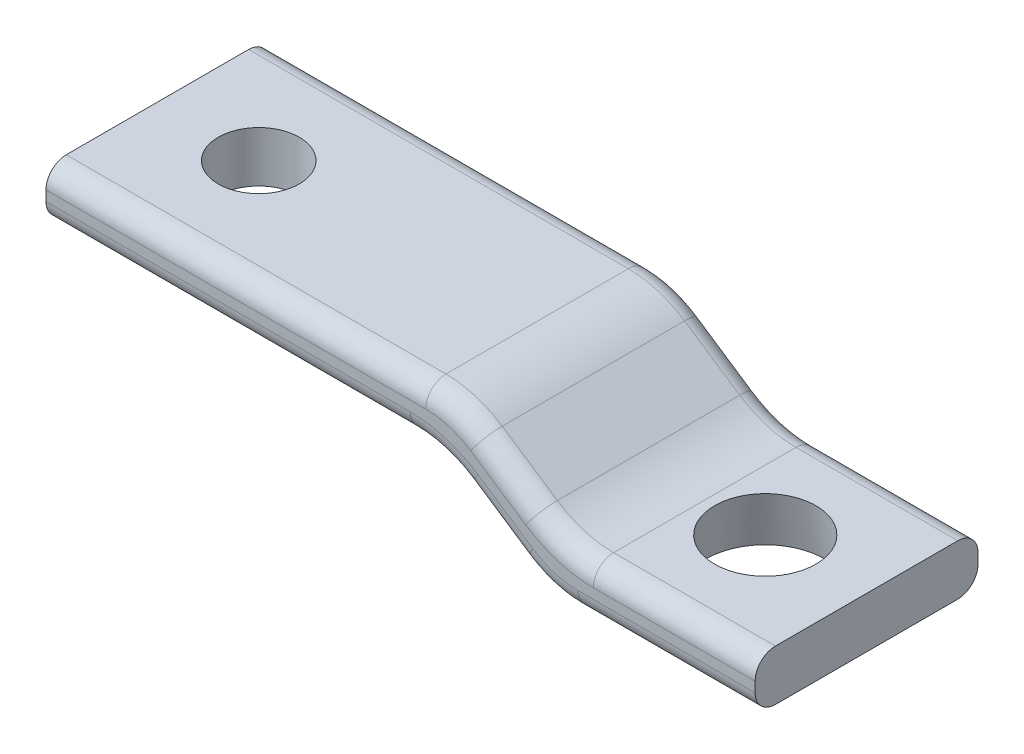
ISO-10303-21;
HEADER;
FILE_DESCRIPTION(('STEP AP214'),'2;1');
FILE_NAME('part.step','',(''),(''),'','','');
FILE_SCHEMA(('AUTOMOTIVE_DESIGN { 1 0 10303 214 1 1 1 1 }'));
ENDSEC;
DATA;
#1=APPLICATION_CONTEXT('core data for automotive mechanical design processes');
#2=APPLICATION_PROTOCOL_DEFINITION('international standard','automotive_design',2000,#1);
#3=PRODUCT_CONTEXT('',#1,'mechanical');
#4=PRODUCT('Part','Part','',(#3));
#5=PRODUCT_RELATED_PRODUCT_CATEGORY('part','',(#4));
#6=PRODUCT_DEFINITION_FORMATION('','',#4);
#7=PRODUCT_DEFINITION_CONTEXT('part definition',#1,'design');
#8=PRODUCT_DEFINITION('design','',#6,#7);
#9=PRODUCT_DEFINITION_SHAPE('','',#8);
#10=(LENGTH_UNIT() NAMED_UNIT(*) SI_UNIT(.MILLI.,.METRE.));
#11=(NAMED_UNIT(*) PLANE_ANGLE_UNIT() SI_UNIT($,.RADIAN.));
#12=(NAMED_UNIT(*) SI_UNIT($,.STERADIAN.) SOLID_ANGLE_UNIT());
#13=UNCERTAINTY_MEASURE_WITH_UNIT(LENGTH_MEASURE(1.E-05),#10,'distance_accuracy_value','');
#14=(GEOMETRIC_REPRESENTATION_CONTEXT(3) GLOBAL_UNCERTAINTY_ASSIGNED_CONTEXT((#13)) GLOBAL_UNIT_ASSIGNED_CONTEXT((#10,
#11,#12)) REPRESENTATION_CONTEXT('',''));
#15=CARTESIAN_POINT('',(0.,0.,0.));
#16=DIRECTION('',(0.,0.,1.));
#17=DIRECTION('',(1.,0.,0.));
#18=AXIS2_PLACEMENT_3D('',#15,#16,#17);
#19=CARTESIAN_POINT('',(52.5157724893177,-12.,11.));
#20=DIRECTION('',(0.,1.,0.));
#21=DIRECTION('',(0.,0.,1.));
#22=AXIS2_PLACEMENT_3D('',#19,#20,#21);
#23=PLANE('',#22);
#24=DIRECTION('',(0.,0.,-1.));
#25=VECTOR('',#24,1.);
#26=CARTESIAN_POINT('',(70.,-12.,11.));
#27=LINE('',#26,#25);
#28=CARTESIAN_POINT('',(70.,-12.,9.));
#29=VERTEX_POINT('',#28);
#30=CARTESIAN_POINT('',(70.,-12.,-9.));
#31=VERTEX_POINT('',#30);
#32=EDGE_CURVE('E321',#29,#31,#27,.T.);
#33=ORIENTED_EDGE('',*,*,#32,.F.);
#34=DIRECTION('',(1.,0.,0.));
#35=VECTOR('',#34,1.);
#36=CARTESIAN_POINT('',(52.5157724893177,-12.,9.));
#37=LINE('',#36,#35);
#38=CARTESIAN_POINT('',(52.5157724893177,-12.,9.));
#39=VERTEX_POINT('',#38);
#40=EDGE_CURVE('E275',#29,#39,#37,.F.);
#41=ORIENTED_EDGE('',*,*,#40,.T.);
#42=DIRECTION('',(0.,0.,-1.));
#43=VECTOR('',#42,1.);
#44=CARTESIAN_POINT('',(52.5157724893177,-12.,11.));
#45=LINE('',#44,#43);
#46=CARTESIAN_POINT('',(52.5157724893177,-12.,-9.));
#47=VERTEX_POINT('',#46);
#48=EDGE_CURVE('E318',#39,#47,#45,.T.);
#49=ORIENTED_EDGE('',*,*,#48,.T.);
#50=DIRECTION('',(1.,0.,0.));
#51=VECTOR('',#50,1.);
#52=CARTESIAN_POINT('',(52.5157724893177,-12.,-9.));
#53=LINE('',#52,#51);
#54=EDGE_CURVE('E277',#47,#31,#53,.T.);
#55=ORIENTED_EDGE('',*,*,#54,.T.);
#56=EDGE_LOOP('',(#33,#41,#49,#55));
#57=FACE_BOUND('',#56,.T.);
#58=CARTESIAN_POINT('',(60.,-12.,0.));
#59=DIRECTION('',(0.,1.,0.));
#60=DIRECTION('',(0.,0.,1.));
#61=AXIS2_PLACEMENT_3D('',#58,#59,#60);
#62=CIRCLE('',#61,5.88163490354233);
#63=CARTESIAN_POINT('',(60.,-12.,5.88163490354233));
#64=VERTEX_POINT('',#63);
#65=EDGE_CURVE('E398',#64,#64,#62,.T.);
#66=ORIENTED_EDGE('',*,*,#65,.T.);
#67=EDGE_LOOP('',(#66));
#68=FACE_BOUND('',#67,.T.);
#69=ADVANCED_FACE('F35',(#57,#68),#23,.F.);
#70=CARTESIAN_POINT('',(54.0315449786353,-7.,11.));
#71=DIRECTION('',(0.,-1.,0.));
#72=DIRECTION('',(0.,0.,-1.));
#73=AXIS2_PLACEMENT_3D('',#70,#71,#72);
#74=PLANE('',#73);
#75=DIRECTION('',(0.,0.,-1.));
#76=VECTOR('',#75,1.);
#77=CARTESIAN_POINT('',(54.0315449786353,-7.,11.));
#78=LINE('',#77,#76);
#79=CARTESIAN_POINT('',(54.0315449786353,-7.,9.));
#80=VERTEX_POINT('',#79);
#81=CARTESIAN_POINT('',(54.0315449786353,-7.,-9.));
#82=VERTEX_POINT('',#81);
#83=EDGE_CURVE('E327',#80,#82,#78,.T.);
#84=ORIENTED_EDGE('',*,*,#83,.F.);
#85=DIRECTION('',(-1.,0.,0.));
#86=VECTOR('',#85,1.);
#87=CARTESIAN_POINT('',(70.,-7.,9.));
#88=LINE('',#87,#86);
#89=CARTESIAN_POINT('',(70.,-7.,9.));
#90=VERTEX_POINT('',#89);
#91=EDGE_CURVE('E258',#80,#90,#88,.F.);
#92=ORIENTED_EDGE('',*,*,#91,.T.);
#93=DIRECTION('',(0.,0.,-1.));
#94=VECTOR('',#93,1.);
#95=CARTESIAN_POINT('',(70.,-7.,11.));
#96=LINE('',#95,#94);
#97=CARTESIAN_POINT('',(70.,-7.,-9.));
#98=VERTEX_POINT('',#97);
#99=EDGE_CURVE('E324',#90,#98,#96,.T.);
#100=ORIENTED_EDGE('',*,*,#99,.T.);
#101=DIRECTION('',(-1.,0.,0.));
#102=VECTOR('',#101,1.);
#103=CARTESIAN_POINT('',(54.0315449786353,-7.,-9.));
#104=LINE('',#103,#102);
#105=EDGE_CURVE('E260',#98,#82,#104,.T.);
#106=ORIENTED_EDGE('',*,*,#105,.T.);
#107=EDGE_LOOP('',(#84,#92,#100,#106));
#108=FACE_BOUND('',#107,.T.);
#109=CARTESIAN_POINT('',(60.,-7.,0.));
#110=DIRECTION('',(0.,1.,0.));
#111=DIRECTION('',(0.,0.,1.));
#112=AXIS2_PLACEMENT_3D('',#109,#110,#111);
#113=CIRCLE('',#112,5.);
#114=CARTESIAN_POINT('',(60.,-7.,5.));
#115=VERTEX_POINT('',#114);
#116=EDGE_CURVE('E401',#115,#115,#113,.T.);
#117=ORIENTED_EDGE('',*,*,#116,.F.);
#118=EDGE_LOOP('',(#117));
#119=FACE_BOUND('',#118,.T.);
#120=ADVANCED_FACE('F408',(#108,#119),#74,.F.);
#121=CARTESIAN_POINT('',(0.,0.,11.));
#122=DIRECTION('',(1.,0.,0.));
#123=DIRECTION('',(0.,0.,-1.));
#124=AXIS2_PLACEMENT_3D('',#121,#122,#123);
#125=PLANE('',#124);
#126=DIRECTION('',(0.,0.,-1.));
#127=VECTOR('',#126,1.);
#128=CARTESIAN_POINT('',(0.,-5.,11.));
#129=LINE('',#128,#127);
#130=CARTESIAN_POINT('',(0.,-5.,9.));
#131=VERTEX_POINT('',#130);
#132=CARTESIAN_POINT('',(0.,-5.,-9.));
#133=VERTEX_POINT('',#132);
#134=EDGE_CURVE('E205',#131,#133,#129,.T.);
#135=ORIENTED_EDGE('',*,*,#134,.F.);
#136=CARTESIAN_POINT('',(0.,-3.,9.));
#137=DIRECTION('',(1.,0.,0.));
#138=DIRECTION('',(0.,0.,-1.));
#139=AXIS2_PLACEMENT_3D('',#136,#137,#138);
#140=CIRCLE('',#139,2.);
#141=CARTESIAN_POINT('',(0.,-3.,11.));
#142=VERTEX_POINT('',#141);
#143=EDGE_CURVE('E209',#131,#142,#140,.F.);
#144=ORIENTED_EDGE('',*,*,#143,.T.);
#145=DIRECTION('',(0.,-1.,0.));
#146=VECTOR('',#145,1.);
#147=CARTESIAN_POINT('',(0.,0.,11.));
#148=LINE('',#147,#146);
#149=CARTESIAN_POINT('',(0.,-2.,11.));
#150=VERTEX_POINT('',#149);
#151=EDGE_CURVE('E198',#150,#142,#148,.T.);
#152=ORIENTED_EDGE('',*,*,#151,.F.);
#153=CARTESIAN_POINT('',(0.,-2.,9.));
#154=DIRECTION('',(1.,0.,0.));
#155=DIRECTION('',(0.,0.,-1.));
#156=AXIS2_PLACEMENT_3D('',#153,#154,#155);
#157=CIRCLE('',#156,2.);
#158=CARTESIAN_POINT('',(0.,0.,9.));
#159=VERTEX_POINT('',#158);
#160=EDGE_CURVE('E56',#150,#159,#157,.F.);
#161=ORIENTED_EDGE('',*,*,#160,.T.);
#162=DIRECTION('',(0.,0.,-1.));
#163=VECTOR('',#162,1.);
#164=CARTESIAN_POINT('',(0.,0.,11.));
#165=LINE('',#164,#163);
#166=CARTESIAN_POINT('',(0.,0.,-9.));
#167=VERTEX_POINT('',#166);
#168=EDGE_CURVE('E338',#159,#167,#165,.T.);
#169=ORIENTED_EDGE('',*,*,#168,.T.);
#170=CARTESIAN_POINT('',(0.,-2.,-9.));
#171=DIRECTION('',(1.,0.,0.));
#172=DIRECTION('',(0.,0.,-1.));
#173=AXIS2_PLACEMENT_3D('',#170,#171,#172);
#174=CIRCLE('',#173,2.);
#175=CARTESIAN_POINT('',(0.,-2.,-11.));
#176=VERTEX_POINT('',#175);
#177=EDGE_CURVE('E218',#167,#176,#174,.F.);
#178=ORIENTED_EDGE('',*,*,#177,.T.);
#179=DIRECTION('',(0.,-1.,0.));
#180=VECTOR('',#179,1.);
#181=CARTESIAN_POINT('',(0.,0.,-11.));
#182=LINE('',#181,#180);
#183=CARTESIAN_POINT('',(0.,-3.,-11.));
#184=VERTEX_POINT('',#183);
#185=EDGE_CURVE('E344',#176,#184,#182,.T.);
#186=ORIENTED_EDGE('',*,*,#185,.T.);
#187=CARTESIAN_POINT('',(0.,-3.,-9.));
#188=DIRECTION('',(1.,0.,0.));
#189=DIRECTION('',(0.,0.,-1.));
#190=AXIS2_PLACEMENT_3D('',#187,#188,#189);
#191=CIRCLE('',#190,2.);
#192=EDGE_CURVE('E215',#184,#133,#191,.F.);
#193=ORIENTED_EDGE('',*,*,#192,.T.);
#194=EDGE_LOOP('',(#135,#144,#152,#161,#169,#178,#186,#193));
#195=FACE_BOUND('',#194,.T.);
#196=ADVANCED_FACE('F37',(#195),#125,.F.);
#197=CARTESIAN_POINT('',(0.,-5.,11.));
#198=DIRECTION('',(0.,1.,0.));
#199=DIRECTION('',(-1.,0.,0.));
#200=AXIS2_PLACEMENT_3D('',#197,#198,#199);
#201=PLANE('',#200);
#202=CARTESIAN_POINT('',(10.,-5.,0.));
#203=DIRECTION('',(0.,1.,0.));
#204=DIRECTION('',(-1.,0.,0.));
#205=AXIS2_PLACEMENT_3D('',#202,#203,#204);
#206=CIRCLE('',#205,4.);
#207=CARTESIAN_POINT('',(6.,-5.,0.));
#208=VERTEX_POINT('',#207);
#209=EDGE_CURVE('E392',#208,#208,#206,.T.);
#210=ORIENTED_EDGE('',*,*,#209,.T.);
#211=EDGE_LOOP('',(#210));
#212=FACE_BOUND('',#211,.T.);
#213=DIRECTION('',(0.,0.,-1.));
#214=VECTOR('',#213,1.);
#215=CARTESIAN_POINT('',(35.9684550213647,-5.,11.));
#216=LINE('',#215,#214);
#217=CARTESIAN_POINT('',(35.9684550213647,-5.,9.));
#218=VERTEX_POINT('',#217);
#219=CARTESIAN_POINT('',(35.9684550213647,-5.,-9.));
#220=VERTEX_POINT('',#219);
#221=EDGE_CURVE('E309',#218,#220,#216,.T.);
#222=ORIENTED_EDGE('',*,*,#221,.F.);
#223=DIRECTION('',(1.,0.,0.));
#224=VECTOR('',#223,1.);
#225=CARTESIAN_POINT('',(0.,-5.,9.));
#226=LINE('',#225,#224);
#227=EDGE_CURVE('E222',#218,#131,#226,.F.);
#228=ORIENTED_EDGE('',*,*,#227,.T.);
#229=ORIENTED_EDGE('',*,*,#134,.T.);
#230=DIRECTION('',(1.,0.,0.));
#231=VECTOR('',#230,1.);
#232=CARTESIAN_POINT('',(0.,-5.,-9.));
#233=LINE('',#232,#231);
#234=EDGE_CURVE('E224',#133,#220,#233,.T.);
#235=ORIENTED_EDGE('',*,*,#234,.T.);
#236=EDGE_LOOP('',(#222,#228,#229,#235));
#237=FACE_BOUND('',#236,.T.);
#238=ADVANCED_FACE('F416',(#212,#237),#201,.F.);
#239=CARTESIAN_POINT('',(35.9684550213647,-15.,11.));
#240=DIRECTION('',(0.,0.,-1.));
#241=DIRECTION('',(-1.,0.,0.));
#242=AXIS2_PLACEMENT_3D('',#239,#240,#241);
#243=CYLINDRICAL_SURFACE('',#242,10.);
#244=DIRECTION('',(0.,0.,-1.));
#245=VECTOR('',#244,1.);
#246=CARTESIAN_POINT('',(41.5212302249336,-6.68334877858698,11.));
#247=LINE('',#246,#245);
#248=CARTESIAN_POINT('',(41.5212302249336,-6.68334877858698,9.));
#249=VERTEX_POINT('',#248);
#250=CARTESIAN_POINT('',(41.5212302249336,-6.68334877858698,-9.));
#251=VERTEX_POINT('',#250);
#252=EDGE_CURVE('E312',#249,#251,#247,.T.);
#253=ORIENTED_EDGE('',*,*,#252,.F.);
#254=CARTESIAN_POINT('',(35.9684550213647,-15.,9.));
#255=DIRECTION('',(0.,0.,1.));
#256=DIRECTION('',(1.,0.,0.));
#257=AXIS2_PLACEMENT_3D('',#254,#255,#256);
#258=CIRCLE('',#257,10.);
#259=EDGE_CURVE('E263',#249,#218,#258,.T.);
#260=ORIENTED_EDGE('',*,*,#259,.T.);
#261=ORIENTED_EDGE('',*,*,#221,.T.);
#262=CARTESIAN_POINT('',(35.9684550213647,-15.,-9.));
#263=DIRECTION('',(0.,0.,1.));
#264=DIRECTION('',(1.,0.,0.));
#265=AXIS2_PLACEMENT_3D('',#262,#263,#264);
#266=CIRCLE('',#265,10.);
#267=EDGE_CURVE('E265',#220,#251,#266,.F.);
#268=ORIENTED_EDGE('',*,*,#267,.T.);
#269=EDGE_LOOP('',(#253,#260,#261,#268));
#270=FACE_BOUND('',#269,.T.);
#271=ADVANCED_FACE('F435',(#270),#243,.F.);
#272=CARTESIAN_POINT('',(41.5212302249336,-6.68334877858698,11.));
#273=DIRECTION('',(0.555277520356883,0.831665122141305,0.));
#274=DIRECTION('',(-0.831665122141305,0.555277520356883,0.));
#275=AXIS2_PLACEMENT_3D('',#272,#273,#274);
#276=PLANE('',#275);
#277=DIRECTION('',(0.,0.,-1.));
#278=VECTOR('',#277,1.);
#279=CARTESIAN_POINT('',(46.9629972857488,-10.316651221413,11.));
#280=LINE('',#279,#278);
#281=CARTESIAN_POINT('',(46.9629972857488,-10.316651221413,9.));
#282=VERTEX_POINT('',#281);
#283=CARTESIAN_POINT('',(46.9629972857488,-10.316651221413,-9.));
#284=VERTEX_POINT('',#283);
#285=EDGE_CURVE('E315',#282,#284,#280,.T.);
#286=ORIENTED_EDGE('',*,*,#285,.F.);
#287=DIRECTION('',(0.831665122141305,-0.555277520356883,0.));
#288=VECTOR('',#287,1.);
#289=CARTESIAN_POINT('',(41.5212302249336,-6.68334877858698,9.));
#290=LINE('',#289,#288);
#291=EDGE_CURVE('E267',#282,#249,#290,.F.);
#292=ORIENTED_EDGE('',*,*,#291,.T.);
#293=ORIENTED_EDGE('',*,*,#252,.T.);
#294=DIRECTION('',(0.831665122141305,-0.555277520356883,0.));
#295=VECTOR('',#294,1.);
#296=CARTESIAN_POINT('',(41.5212302249336,-6.68334877858698,-9.));
#297=LINE('',#296,#295);
#298=EDGE_CURVE('E269',#251,#284,#297,.T.);
#299=ORIENTED_EDGE('',*,*,#298,.T.);
#300=EDGE_LOOP('',(#286,#292,#293,#299));
#301=FACE_BOUND('',#300,.T.);
#302=ADVANCED_FACE('F431',(#301),#276,.F.);
#303=CARTESIAN_POINT('',(52.5157724893176,-2.,11.));
#304=DIRECTION('',(0.,0.,-1.));
#305=DIRECTION('',(-1.,0.,0.));
#306=AXIS2_PLACEMENT_3D('',#303,#304,#305);
#307=CYLINDRICAL_SURFACE('',#306,10.);
#308=ORIENTED_EDGE('',*,*,#48,.F.);
#309=CARTESIAN_POINT('',(52.5157724893176,-2.,9.));
#310=DIRECTION('',(0.,0.,1.));
#311=DIRECTION('',(1.,0.,0.));
#312=AXIS2_PLACEMENT_3D('',#309,#310,#311);
#313=CIRCLE('',#312,10.);
#314=EDGE_CURVE('E271',#39,#282,#313,.F.);
#315=ORIENTED_EDGE('',*,*,#314,.T.);
#316=ORIENTED_EDGE('',*,*,#285,.T.);
#317=CARTESIAN_POINT('',(52.5157724893176,-2.,-9.));
#318=DIRECTION('',(0.,0.,1.));
#319=DIRECTION('',(1.,0.,0.));
#320=AXIS2_PLACEMENT_3D('',#317,#318,#319);
#321=CIRCLE('',#320,10.);
#322=EDGE_CURVE('E273',#284,#47,#321,.T.);
#323=ORIENTED_EDGE('',*,*,#322,.T.);
#324=EDGE_LOOP('',(#308,#315,#316,#323));
#325=FACE_BOUND('',#324,.T.);
#326=ADVANCED_FACE('F426',(#325),#307,.T.);
#327=CARTESIAN_POINT('',(70.,-7.,11.));
#328=DIRECTION('',(-1.,0.,0.));
#329=DIRECTION('',(0.,0.,1.));
#330=AXIS2_PLACEMENT_3D('',#327,#328,#329);
#331=PLANE('',#330);
#332=DIRECTION('',(0.,1.,0.));
#333=VECTOR('',#332,1.);
#334=CARTESIAN_POINT('',(70.,-7.,11.));
#335=LINE('',#334,#333);
#336=CARTESIAN_POINT('',(70.,-10.,11.));
#337=VERTEX_POINT('',#336);
#338=CARTESIAN_POINT('',(70.,-9.,11.));
#339=VERTEX_POINT('',#338);
#340=EDGE_CURVE('E210',#337,#339,#335,.T.);
#341=ORIENTED_EDGE('',*,*,#340,.F.);
#342=CARTESIAN_POINT('',(70.,-10.,9.));
#343=DIRECTION('',(-1.,0.,0.));
#344=DIRECTION('',(0.,0.,1.));
#345=AXIS2_PLACEMENT_3D('',#342,#343,#344);
#346=CIRCLE('',#345,2.);
#347=EDGE_CURVE('E280',#337,#29,#346,.F.);
#348=ORIENTED_EDGE('',*,*,#347,.T.);
#349=ORIENTED_EDGE('',*,*,#32,.T.);
#350=CARTESIAN_POINT('',(70.,-10.,-9.));
#351=DIRECTION('',(-1.,0.,0.));
#352=DIRECTION('',(0.,0.,1.));
#353=AXIS2_PLACEMENT_3D('',#350,#351,#352);
#354=CIRCLE('',#353,2.);
#355=CARTESIAN_POINT('',(70.,-10.,-11.));
#356=VERTEX_POINT('',#355);
#357=EDGE_CURVE('E284',#31,#356,#354,.F.);
#358=ORIENTED_EDGE('',*,*,#357,.T.);
#359=DIRECTION('',(0.,1.,0.));
#360=VECTOR('',#359,1.);
#361=CARTESIAN_POINT('',(70.,-7.,-11.));
#362=LINE('',#361,#360);
#363=CARTESIAN_POINT('',(70.,-9.,-11.));
#364=VERTEX_POINT('',#363);
#365=EDGE_CURVE('E211',#356,#364,#362,.T.);
#366=ORIENTED_EDGE('',*,*,#365,.T.);
#367=CARTESIAN_POINT('',(70.,-9.,-9.));
#368=DIRECTION('',(-1.,0.,0.));
#369=DIRECTION('',(0.,0.,1.));
#370=AXIS2_PLACEMENT_3D('',#367,#368,#369);
#371=CIRCLE('',#370,2.);
#372=EDGE_CURVE('E286',#364,#98,#371,.F.);
#373=ORIENTED_EDGE('',*,*,#372,.T.);
#374=ORIENTED_EDGE('',*,*,#99,.F.);
#375=CARTESIAN_POINT('',(70.,-9.,9.));
#376=DIRECTION('',(-1.,0.,0.));
#377=DIRECTION('',(0.,0.,1.));
#378=AXIS2_PLACEMENT_3D('',#375,#376,#377);
#379=CIRCLE('',#378,2.);
#380=EDGE_CURVE('E282',#90,#339,#379,.F.);
#381=ORIENTED_EDGE('',*,*,#380,.T.);
#382=EDGE_LOOP('',(#341,#348,#349,#358,#366,#373,#374,#381));
#383=FACE_BOUND('',#382,.T.);
#384=ADVANCED_FACE('F424',(#383),#331,.F.);
#385=CARTESIAN_POINT('',(54.0315449786353,3.,11.));
#386=DIRECTION('',(0.,0.,-1.));
#387=DIRECTION('',(-1.,0.,0.));
#388=AXIS2_PLACEMENT_3D('',#385,#386,#387);
#389=CYLINDRICAL_SURFACE('',#388,10.);
#390=DIRECTION('',(0.,0.,-1.));
#391=VECTOR('',#390,1.);
#392=CARTESIAN_POINT('',(48.4787697750664,-5.31665122141302,11.));
#393=LINE('',#392,#391);
#394=CARTESIAN_POINT('',(48.4787697750664,-5.31665122141302,9.));
#395=VERTEX_POINT('',#394);
#396=CARTESIAN_POINT('',(48.4787697750664,-5.31665122141302,-9.));
#397=VERTEX_POINT('',#396);
#398=EDGE_CURVE('E330',#395,#397,#393,.T.);
#399=ORIENTED_EDGE('',*,*,#398,.F.);
#400=CARTESIAN_POINT('',(54.0315449786353,3.,9.));
#401=DIRECTION('',(0.,0.,1.));
#402=DIRECTION('',(1.,0.,0.));
#403=AXIS2_PLACEMENT_3D('',#400,#401,#402);
#404=CIRCLE('',#403,10.);
#405=EDGE_CURVE('E254',#395,#80,#404,.T.);
#406=ORIENTED_EDGE('',*,*,#405,.T.);
#407=ORIENTED_EDGE('',*,*,#83,.T.);
#408=CARTESIAN_POINT('',(54.0315449786353,3.,-9.));
#409=DIRECTION('',(0.,0.,1.));
#410=DIRECTION('',(1.,0.,0.));
#411=AXIS2_PLACEMENT_3D('',#408,#409,#410);
#412=CIRCLE('',#411,10.);
#413=EDGE_CURVE('E256',#82,#397,#412,.F.);
#414=ORIENTED_EDGE('',*,*,#413,.T.);
#415=EDGE_LOOP('',(#399,#406,#407,#414));
#416=FACE_BOUND('',#415,.T.);
#417=ADVANCED_FACE('F422',(#416),#389,.F.);
#418=CARTESIAN_POINT('',(43.0370027142512,-1.68334877858698,11.));
#419=DIRECTION('',(-0.555277520356883,-0.831665122141305,0.));
#420=DIRECTION('',(0.831665122141305,-0.555277520356883,0.));
#421=AXIS2_PLACEMENT_3D('',#418,#419,#420);
#422=PLANE('',#421);
#423=DIRECTION('',(0.,0.,-1.));
#424=VECTOR('',#423,1.);
#425=CARTESIAN_POINT('',(43.0370027142512,-1.68334877858697,11.));
#426=LINE('',#425,#424);
#427=CARTESIAN_POINT('',(43.0370027142512,-1.68334877858697,9.));
#428=VERTEX_POINT('',#427);
#429=CARTESIAN_POINT('',(43.0370027142512,-1.68334877858697,-9.));
#430=VERTEX_POINT('',#429);
#431=EDGE_CURVE('E333',#428,#430,#426,.T.);
#432=ORIENTED_EDGE('',*,*,#431,.F.);
#433=DIRECTION('',(-0.831665122141305,0.555277520356883,0.));
#434=VECTOR('',#433,1.);
#435=CARTESIAN_POINT('',(48.4787697750664,-5.31665122141302,9.));
#436=LINE('',#435,#434);
#437=EDGE_CURVE('E250',#428,#395,#436,.F.);
#438=ORIENTED_EDGE('',*,*,#437,.T.);
#439=ORIENTED_EDGE('',*,*,#398,.T.);
#440=DIRECTION('',(-0.831665122141305,0.555277520356883,0.));
#441=VECTOR('',#440,1.);
#442=CARTESIAN_POINT('',(43.0370027142512,-1.68334877858698,-9.));
#443=LINE('',#442,#441);
#444=EDGE_CURVE('E252',#397,#430,#443,.T.);
#445=ORIENTED_EDGE('',*,*,#444,.T.);
#446=EDGE_LOOP('',(#432,#438,#439,#445));
#447=FACE_BOUND('',#446,.T.);
#448=ADVANCED_FACE('F506',(#447),#422,.F.);
#449=CARTESIAN_POINT('',(37.4842275106824,-10.,11.));
#450=DIRECTION('',(0.,0.,-1.));
#451=DIRECTION('',(-1.,0.,0.));
#452=AXIS2_PLACEMENT_3D('',#449,#450,#451);
#453=CYLINDRICAL_SURFACE('',#452,10.);
#454=DIRECTION('',(0.,0.,-1.));
#455=VECTOR('',#454,1.);
#456=CARTESIAN_POINT('',(37.4842275106823,0.,11.));
#457=LINE('',#456,#455);
#458=CARTESIAN_POINT('',(37.4842275106823,0.,9.));
#459=VERTEX_POINT('',#458);
#460=CARTESIAN_POINT('',(37.4842275106823,0.,-9.));
#461=VERTEX_POINT('',#460);
#462=EDGE_CURVE('E336',#459,#461,#457,.T.);
#463=ORIENTED_EDGE('',*,*,#462,.F.);
#464=CARTESIAN_POINT('',(37.4842275106824,-10.,9.));
#465=DIRECTION('',(0.,0.,1.));
#466=DIRECTION('',(1.,0.,0.));
#467=AXIS2_PLACEMENT_3D('',#464,#465,#466);
#468=CIRCLE('',#467,10.);
#469=EDGE_CURVE('E246',#459,#428,#468,.F.);
#470=ORIENTED_EDGE('',*,*,#469,.T.);
#471=ORIENTED_EDGE('',*,*,#431,.T.);
#472=CARTESIAN_POINT('',(37.4842275106824,-10.,-9.));
#473=DIRECTION('',(0.,0.,1.));
#474=DIRECTION('',(1.,0.,0.));
#475=AXIS2_PLACEMENT_3D('',#472,#473,#474);
#476=CIRCLE('',#475,10.);
#477=EDGE_CURVE('E248',#430,#461,#476,.T.);
#478=ORIENTED_EDGE('',*,*,#477,.T.);
#479=EDGE_LOOP('',(#463,#470,#471,#478));
#480=FACE_BOUND('',#479,.T.);
#481=ADVANCED_FACE('F518',(#480),#453,.T.);
#482=CARTESIAN_POINT('',(0.,0.,11.));
#483=DIRECTION('',(0.,-1.,0.));
#484=DIRECTION('',(0.,0.,-1.));
#485=AXIS2_PLACEMENT_3D('',#482,#483,#484);
#486=PLANE('',#485);
#487=CARTESIAN_POINT('',(10.,0.,0.));
#488=DIRECTION('',(0.,1.,0.));
#489=DIRECTION('',(0.,0.,1.));
#490=AXIS2_PLACEMENT_3D('',#487,#488,#489);
#491=CIRCLE('',#490,4.);
#492=CARTESIAN_POINT('',(10.,0.,4.));
#493=VERTEX_POINT('',#492);
#494=EDGE_CURVE('E395',#493,#493,#491,.T.);
#495=ORIENTED_EDGE('',*,*,#494,.F.);
#496=EDGE_LOOP('',(#495));
#497=FACE_BOUND('',#496,.T.);
#498=ORIENTED_EDGE('',*,*,#168,.F.);
#499=DIRECTION('',(-1.,0.,0.));
#500=VECTOR('',#499,1.);
#501=CARTESIAN_POINT('',(37.4842275106823,0.,9.));
#502=LINE('',#501,#500);
#503=EDGE_CURVE('E11',#159,#459,#502,.F.);
#504=ORIENTED_EDGE('',*,*,#503,.T.);
#505=ORIENTED_EDGE('',*,*,#462,.T.);
#506=DIRECTION('',(-1.,0.,0.));
#507=VECTOR('',#506,1.);
#508=CARTESIAN_POINT('',(0.,0.,-9.));
#509=LINE('',#508,#507);
#510=EDGE_CURVE('E43',#461,#167,#509,.T.);
#511=ORIENTED_EDGE('',*,*,#510,.T.);
#512=EDGE_LOOP('',(#498,#504,#505,#511));
#513=FACE_BOUND('',#512,.T.);
#514=ADVANCED_FACE('F519',(#497,#513),#486,.F.);
#515=CARTESIAN_POINT('',(35.9684550213647,-15.,11.));
#516=DIRECTION('',(0.,0.,1.));
#517=DIRECTION('',(1.,0.,0.));
#518=AXIS2_PLACEMENT_3D('',#515,#516,#517);
#519=PLANE('',#518);
#520=CARTESIAN_POINT('',(52.5157724893176,-2.,11.));
#521=DIRECTION('',(0.,0.,1.));
#522=DIRECTION('',(1.,0.,0.));
#523=AXIS2_PLACEMENT_3D('',#520,#521,#522);
#524=CIRCLE('',#523,8.);
#525=CARTESIAN_POINT('',(48.0735523264625,-8.65332097713042,11.));
#526=VERTEX_POINT('',#525);
#527=CARTESIAN_POINT('',(52.5157724893177,-10.,11.));
#528=VERTEX_POINT('',#527);
#529=EDGE_CURVE('E291',#526,#528,#524,.T.);
#530=ORIENTED_EDGE('',*,*,#529,.T.);
#531=DIRECTION('',(1.,0.,0.));
#532=VECTOR('',#531,1.);
#533=CARTESIAN_POINT('',(70.,-10.,11.));
#534=LINE('',#533,#532);
#535=EDGE_CURVE('E288',#528,#337,#534,.T.);
#536=ORIENTED_EDGE('',*,*,#535,.T.);
#537=ORIENTED_EDGE('',*,*,#340,.T.);
#538=DIRECTION('',(-1.,0.,0.));
#539=VECTOR('',#538,1.);
#540=CARTESIAN_POINT('',(54.0315449786353,-9.,11.));
#541=LINE('',#540,#539);
#542=CARTESIAN_POINT('',(54.0315449786353,-9.,11.));
#543=VERTEX_POINT('',#542);
#544=EDGE_CURVE('E299',#339,#543,#541,.T.);
#545=ORIENTED_EDGE('',*,*,#544,.T.);
#546=CARTESIAN_POINT('',(54.0315449786353,3.,11.));
#547=DIRECTION('',(0.,0.,1.));
#548=DIRECTION('',(1.,0.,0.));
#549=AXIS2_PLACEMENT_3D('',#546,#547,#548);
#550=CIRCLE('',#549,12.);
#551=CARTESIAN_POINT('',(47.3682147343526,-6.97998146569563,11.));
#552=VERTEX_POINT('',#551);
#553=EDGE_CURVE('E302',#543,#552,#550,.F.);
#554=ORIENTED_EDGE('',*,*,#553,.T.);
#555=DIRECTION('',(-0.831665122141305,0.555277520356883,0.));
#556=VECTOR('',#555,1.);
#557=CARTESIAN_POINT('',(41.9264476735375,-3.34667902286958,11.));
#558=LINE('',#557,#556);
#559=CARTESIAN_POINT('',(41.9264476735375,-3.34667902286958,11.));
#560=VERTEX_POINT('',#559);
#561=EDGE_CURVE('E304',#552,#560,#558,.T.);
#562=ORIENTED_EDGE('',*,*,#561,.T.);
#563=CARTESIAN_POINT('',(37.4842275106824,-10.,11.));
#564=DIRECTION('',(0.,0.,1.));
#565=DIRECTION('',(1.,0.,0.));
#566=AXIS2_PLACEMENT_3D('',#563,#564,#565);
#567=CIRCLE('',#566,8.);
#568=CARTESIAN_POINT('',(37.4842275106823,-2.,11.));
#569=VERTEX_POINT('',#568);
#570=EDGE_CURVE('E201',#560,#569,#567,.T.);
#571=ORIENTED_EDGE('',*,*,#570,.T.);
#572=DIRECTION('',(-1.,0.,0.));
#573=VECTOR('',#572,1.);
#574=CARTESIAN_POINT('',(0.,-2.,11.));
#575=LINE('',#574,#573);
#576=EDGE_CURVE('E196',#569,#150,#575,.T.);
#577=ORIENTED_EDGE('',*,*,#576,.T.);
#578=ORIENTED_EDGE('',*,*,#151,.T.);
#579=DIRECTION('',(1.,0.,0.));
#580=VECTOR('',#579,1.);
#581=CARTESIAN_POINT('',(35.9684550213647,-3.,11.));
#582=LINE('',#581,#580);
#583=CARTESIAN_POINT('',(35.9684550213647,-3.,11.));
#584=VERTEX_POINT('',#583);
#585=EDGE_CURVE('E297',#142,#584,#582,.T.);
#586=ORIENTED_EDGE('',*,*,#585,.T.);
#587=CARTESIAN_POINT('',(35.9684550213647,-15.,11.));
#588=DIRECTION('',(0.,0.,1.));
#589=DIRECTION('',(1.,0.,0.));
#590=AXIS2_PLACEMENT_3D('',#587,#588,#589);
#591=CIRCLE('',#590,12.);
#592=CARTESIAN_POINT('',(42.6317852656474,-5.02001853430437,11.));
#593=VERTEX_POINT('',#592);
#594=EDGE_CURVE('E295',#584,#593,#591,.F.);
#595=ORIENTED_EDGE('',*,*,#594,.T.);
#596=DIRECTION('',(0.831665122141305,-0.555277520356883,0.));
#597=VECTOR('',#596,1.);
#598=CARTESIAN_POINT('',(48.0735523264625,-8.65332097713041,11.));
#599=LINE('',#598,#597);
#600=EDGE_CURVE('E293',#593,#526,#599,.T.);
#601=ORIENTED_EDGE('',*,*,#600,.T.);
#602=EDGE_LOOP('',(#530,#536,#537,#545,#554,#562,#571,#577,#578,#586,#595,#601));
#603=FACE_BOUND('',#602,.T.);
#604=ADVANCED_FACE('F197',(#603),#519,.T.);
#605=CARTESIAN_POINT('',(35.9684550213647,-15.,-11.));
#606=DIRECTION('',(0.,0.,1.));
#607=DIRECTION('',(1.,0.,0.));
#608=AXIS2_PLACEMENT_3D('',#605,#606,#607);
#609=PLANE('',#608);
#610=ORIENTED_EDGE('',*,*,#365,.F.);
#611=DIRECTION('',(1.,0.,0.));
#612=VECTOR('',#611,1.);
#613=CARTESIAN_POINT('',(35.9684550213647,-10.,-11.));
#614=LINE('',#613,#612);
#615=CARTESIAN_POINT('',(52.5157724893177,-10.,-11.));
#616=VERTEX_POINT('',#615);
#617=EDGE_CURVE('E226',#356,#616,#614,.F.);
#618=ORIENTED_EDGE('',*,*,#617,.T.);
#619=CARTESIAN_POINT('',(52.5157724893176,-2.,-11.));
#620=DIRECTION('',(0.,0.,1.));
#621=DIRECTION('',(1.,0.,0.));
#622=AXIS2_PLACEMENT_3D('',#619,#620,#621);
#623=CIRCLE('',#622,8.);
#624=CARTESIAN_POINT('',(48.0735523264625,-8.65332097713042,-11.));
#625=VERTEX_POINT('',#624);
#626=EDGE_CURVE('E228',#616,#625,#623,.F.);
#627=ORIENTED_EDGE('',*,*,#626,.T.);
#628=DIRECTION('',(0.831665122141305,-0.555277520356883,0.));
#629=VECTOR('',#628,1.);
#630=CARTESIAN_POINT('',(42.6317852656473,-5.02001853430435,-11.));
#631=LINE('',#630,#629);
#632=CARTESIAN_POINT('',(42.6317852656474,-5.02001853430437,-11.));
#633=VERTEX_POINT('',#632);
#634=EDGE_CURVE('E230',#625,#633,#631,.F.);
#635=ORIENTED_EDGE('',*,*,#634,.T.);
#636=CARTESIAN_POINT('',(35.9684550213647,-15.,-11.));
#637=DIRECTION('',(0.,0.,1.));
#638=DIRECTION('',(1.,0.,0.));
#639=AXIS2_PLACEMENT_3D('',#636,#637,#638);
#640=CIRCLE('',#639,12.);
#641=CARTESIAN_POINT('',(35.9684550213647,-3.,-11.));
#642=VERTEX_POINT('',#641);
#643=EDGE_CURVE('E232',#633,#642,#640,.T.);
#644=ORIENTED_EDGE('',*,*,#643,.T.);
#645=DIRECTION('',(1.,0.,0.));
#646=VECTOR('',#645,1.);
#647=CARTESIAN_POINT('',(35.9684550213647,-3.,-11.));
#648=LINE('',#647,#646);
#649=EDGE_CURVE('E234',#642,#184,#648,.F.);
#650=ORIENTED_EDGE('',*,*,#649,.T.);
#651=ORIENTED_EDGE('',*,*,#185,.F.);
#652=DIRECTION('',(-1.,0.,0.));
#653=VECTOR('',#652,1.);
#654=CARTESIAN_POINT('',(35.9684550213647,-2.,-11.));
#655=LINE('',#654,#653);
#656=CARTESIAN_POINT('',(37.4842275106823,-2.,-11.));
#657=VERTEX_POINT('',#656);
#658=EDGE_CURVE('E244',#176,#657,#655,.F.);
#659=ORIENTED_EDGE('',*,*,#658,.T.);
#660=CARTESIAN_POINT('',(37.4842275106824,-10.,-11.));
#661=DIRECTION('',(0.,0.,1.));
#662=DIRECTION('',(1.,0.,0.));
#663=AXIS2_PLACEMENT_3D('',#660,#661,#662);
#664=CIRCLE('',#663,8.);
#665=CARTESIAN_POINT('',(41.9264476735375,-3.34667902286958,-11.));
#666=VERTEX_POINT('',#665);
#667=EDGE_CURVE('E242',#657,#666,#664,.F.);
#668=ORIENTED_EDGE('',*,*,#667,.T.);
#669=DIRECTION('',(-0.831665122141305,0.555277520356883,0.));
#670=VECTOR('',#669,1.);
#671=CARTESIAN_POINT('',(43.1870627860042,-4.18835341216304,-11.));
#672=LINE('',#671,#670);
#673=CARTESIAN_POINT('',(47.3682147343526,-6.97998146569563,-11.));
#674=VERTEX_POINT('',#673);
#675=EDGE_CURVE('E240',#666,#674,#672,.F.);
#676=ORIENTED_EDGE('',*,*,#675,.T.);
#677=CARTESIAN_POINT('',(54.0315449786353,3.,-11.));
#678=DIRECTION('',(0.,0.,1.));
#679=DIRECTION('',(1.,0.,0.));
#680=AXIS2_PLACEMENT_3D('',#677,#678,#679);
#681=CIRCLE('',#680,12.);
#682=CARTESIAN_POINT('',(54.0315449786353,-9.,-11.));
#683=VERTEX_POINT('',#682);
#684=EDGE_CURVE('E238',#674,#683,#681,.T.);
#685=ORIENTED_EDGE('',*,*,#684,.T.);
#686=DIRECTION('',(-1.,0.,0.));
#687=VECTOR('',#686,1.);
#688=CARTESIAN_POINT('',(35.9684550213647,-9.,-11.));
#689=LINE('',#688,#687);
#690=EDGE_CURVE('E236',#683,#364,#689,.F.);
#691=ORIENTED_EDGE('',*,*,#690,.T.);
#692=EDGE_LOOP('',(#610,#618,#627,#635,#644,#650,#651,#659,#668,#676,#685,#691));
#693=FACE_BOUND('',#692,.T.);
#694=ADVANCED_FACE('F528',(#693),#609,.F.);
#695=CARTESIAN_POINT('',(35.9684550213647,-3.,9.));
#696=DIRECTION('',(-1.,0.,0.));
#697=DIRECTION('',(0.,-1.,0.));
#698=AXIS2_PLACEMENT_3D('',#695,#696,#697);
#699=CYLINDRICAL_SURFACE('',#698,2.);
#700=ORIENTED_EDGE('',*,*,#143,.F.);
#701=ORIENTED_EDGE('',*,*,#227,.F.);
#702=CARTESIAN_POINT('',(35.9684550213647,-3.,9.));
#703=DIRECTION('',(1.,0.,0.));
#704=DIRECTION('',(0.,1.,0.));
#705=AXIS2_PLACEMENT_3D('',#702,#703,#704);
#706=CIRCLE('',#705,2.);
#707=EDGE_CURVE('E347',#584,#218,#706,.T.);
#708=ORIENTED_EDGE('',*,*,#707,.F.);
#709=ORIENTED_EDGE('',*,*,#585,.F.);
#710=EDGE_LOOP('',(#700,#701,#708,#709));
#711=FACE_BOUND('',#710,.T.);
#712=ADVANCED_FACE('F451',(#711),#699,.T.);
#713=CARTESIAN_POINT('',(35.9684550213647,-15.,9.));
#714=DIRECTION('',(0.,0.,1.));
#715=DIRECTION('',(1.,0.,0.));
#716=AXIS2_PLACEMENT_3D('',#713,#714,#715);
#717=TOROIDAL_SURFACE('',#716,12.,2.);
#718=ORIENTED_EDGE('',*,*,#707,.T.);
#719=ORIENTED_EDGE('',*,*,#259,.F.);
#720=CARTESIAN_POINT('',(42.6317852656474,-5.02001853430437,9.));
#721=DIRECTION('',(0.831665122141305,-0.555277520356882,0.));
#722=DIRECTION('',(0.555277520356882,0.831665122141306,0.));
#723=AXIS2_PLACEMENT_3D('',#720,#721,#722);
#724=CIRCLE('',#723,2.);
#725=EDGE_CURVE('E350',#593,#249,#724,.T.);
#726=ORIENTED_EDGE('',*,*,#725,.F.);
#727=ORIENTED_EDGE('',*,*,#594,.F.);
#728=EDGE_LOOP('',(#718,#719,#726,#727));
#729=FACE_BOUND('',#728,.T.);
#730=ADVANCED_FACE('F455',(#729),#717,.T.);
#731=CARTESIAN_POINT('',(42.6317852656473,-5.02001853430435,9.));
#732=DIRECTION('',(-0.831665122141305,0.555277520356883,0.));
#733=DIRECTION('',(-0.555277520356883,-0.831665122141305,0.));
#734=AXIS2_PLACEMENT_3D('',#731,#732,#733);
#735=CYLINDRICAL_SURFACE('',#734,2.);
#736=ORIENTED_EDGE('',*,*,#725,.T.);
#737=ORIENTED_EDGE('',*,*,#291,.F.);
#738=CARTESIAN_POINT('',(48.0735523264625,-8.65332097713042,9.));
#739=DIRECTION('',(0.831665122141303,-0.555277520356886,0.));
#740=DIRECTION('',(0.555277520356886,0.831665122141303,0.));
#741=AXIS2_PLACEMENT_3D('',#738,#739,#740);
#742=CIRCLE('',#741,2.);
#743=EDGE_CURVE('E353',#526,#282,#742,.T.);
#744=ORIENTED_EDGE('',*,*,#743,.F.);
#745=ORIENTED_EDGE('',*,*,#600,.F.);
#746=EDGE_LOOP('',(#736,#737,#744,#745));
#747=FACE_BOUND('',#746,.T.);
#748=ADVANCED_FACE('F463',(#747),#735,.T.);
#749=CARTESIAN_POINT('',(52.5157724893176,-2.,9.));
#750=DIRECTION('',(0.,0.,1.));
#751=DIRECTION('',(1.,0.,0.));
#752=AXIS2_PLACEMENT_3D('',#749,#750,#751);
#753=TOROIDAL_SURFACE('',#752,8.,2.);
#754=ORIENTED_EDGE('',*,*,#743,.T.);
#755=ORIENTED_EDGE('',*,*,#314,.F.);
#756=CARTESIAN_POINT('',(52.5157724893177,-10.,9.));
#757=DIRECTION('',(1.,0.,0.));
#758=DIRECTION('',(0.,0.,-1.));
#759=AXIS2_PLACEMENT_3D('',#756,#757,#758);
#760=CIRCLE('',#759,2.);
#761=EDGE_CURVE('E356',#528,#39,#760,.T.);
#762=ORIENTED_EDGE('',*,*,#761,.F.);
#763=ORIENTED_EDGE('',*,*,#529,.F.);
#764=EDGE_LOOP('',(#754,#755,#762,#763));
#765=FACE_BOUND('',#764,.T.);
#766=ADVANCED_FACE('F466',(#765),#753,.T.);
#767=CARTESIAN_POINT('',(35.9684550213647,-10.,9.));
#768=DIRECTION('',(-1.,0.,0.));
#769=DIRECTION('',(0.,0.,1.));
#770=AXIS2_PLACEMENT_3D('',#767,#768,#769);
#771=CYLINDRICAL_SURFACE('',#770,2.);
#772=ORIENTED_EDGE('',*,*,#761,.T.);
#773=ORIENTED_EDGE('',*,*,#40,.F.);
#774=ORIENTED_EDGE('',*,*,#347,.F.);
#775=ORIENTED_EDGE('',*,*,#535,.F.);
#776=EDGE_LOOP('',(#772,#773,#774,#775));
#777=FACE_BOUND('',#776,.T.);
#778=ADVANCED_FACE('F470',(#777),#771,.T.);
#779=CARTESIAN_POINT('',(35.9684550213647,-2.,9.));
#780=DIRECTION('',(1.,0.,0.));
#781=DIRECTION('',(0.,0.,-1.));
#782=AXIS2_PLACEMENT_3D('',#779,#780,#781);
#783=CYLINDRICAL_SURFACE('',#782,2.);
#784=ORIENTED_EDGE('',*,*,#160,.F.);
#785=ORIENTED_EDGE('',*,*,#576,.F.);
#786=CARTESIAN_POINT('',(37.4842275106823,-2.,9.));
#787=DIRECTION('',(1.,0.,0.));
#788=DIRECTION('',(0.,0.,-1.));
#789=AXIS2_PLACEMENT_3D('',#786,#787,#788);
#790=CIRCLE('',#789,2.);
#791=EDGE_CURVE('E359',#459,#569,#790,.T.);
#792=ORIENTED_EDGE('',*,*,#791,.F.);
#793=ORIENTED_EDGE('',*,*,#503,.F.);
#794=EDGE_LOOP('',(#784,#785,#792,#793));
#795=FACE_BOUND('',#794,.T.);
#796=ADVANCED_FACE('F214',(#795),#783,.T.);
#797=CARTESIAN_POINT('',(37.4842275106824,-10.,9.));
#798=DIRECTION('',(0.,0.,1.));
#799=DIRECTION('',(1.,0.,0.));
#800=AXIS2_PLACEMENT_3D('',#797,#798,#799);
#801=TOROIDAL_SURFACE('',#800,8.,2.);
#802=ORIENTED_EDGE('',*,*,#791,.T.);
#803=ORIENTED_EDGE('',*,*,#570,.F.);
#804=CARTESIAN_POINT('',(41.9264476735374,-3.34667902286958,9.));
#805=DIRECTION('',(0.831665122141303,-0.555277520356886,0.));
#806=DIRECTION('',(0.555277520356886,0.831665122141303,0.));
#807=AXIS2_PLACEMENT_3D('',#804,#805,#806);
#808=CIRCLE('',#807,2.);
#809=EDGE_CURVE('E361',#428,#560,#808,.T.);
#810=ORIENTED_EDGE('',*,*,#809,.F.);
#811=ORIENTED_EDGE('',*,*,#469,.F.);
#812=EDGE_LOOP('',(#802,#803,#810,#811));
#813=FACE_BOUND('',#812,.T.);
#814=ADVANCED_FACE('F591',(#813),#801,.T.);
#815=CARTESIAN_POINT('',(43.1870627860042,-4.18835341216304,9.));
#816=DIRECTION('',(0.831665122141305,-0.555277520356883,0.));
#817=DIRECTION('',(0.555277520356883,0.831665122141305,0.));
#818=AXIS2_PLACEMENT_3D('',#815,#816,#817);
#819=CYLINDRICAL_SURFACE('',#818,2.);
#820=ORIENTED_EDGE('',*,*,#809,.T.);
#821=ORIENTED_EDGE('',*,*,#561,.F.);
#822=CARTESIAN_POINT('',(47.3682147343526,-6.97998146569563,9.));
#823=DIRECTION('',(0.831665122141305,-0.555277520356883,0.));
#824=DIRECTION('',(0.555277520356883,0.831665122141305,0.));
#825=AXIS2_PLACEMENT_3D('',#822,#823,#824);
#826=CIRCLE('',#825,2.);
#827=EDGE_CURVE('E364',#395,#552,#826,.T.);
#828=ORIENTED_EDGE('',*,*,#827,.F.);
#829=ORIENTED_EDGE('',*,*,#437,.F.);
#830=EDGE_LOOP('',(#820,#821,#828,#829));
#831=FACE_BOUND('',#830,.T.);
#832=ADVANCED_FACE('F485',(#831),#819,.T.);
#833=CARTESIAN_POINT('',(54.0315449786353,3.,9.));
#834=DIRECTION('',(0.,0.,1.));
#835=DIRECTION('',(1.,0.,0.));
#836=AXIS2_PLACEMENT_3D('',#833,#834,#835);
#837=TOROIDAL_SURFACE('',#836,12.,2.);
#838=ORIENTED_EDGE('',*,*,#827,.T.);
#839=ORIENTED_EDGE('',*,*,#553,.F.);
#840=CARTESIAN_POINT('',(54.0315449786353,-9.,9.));
#841=DIRECTION('',(1.,0.,0.));
#842=DIRECTION('',(0.,0.,-1.));
#843=AXIS2_PLACEMENT_3D('',#840,#841,#842);
#844=CIRCLE('',#843,2.);
#845=EDGE_CURVE('E367',#80,#543,#844,.T.);
#846=ORIENTED_EDGE('',*,*,#845,.F.);
#847=ORIENTED_EDGE('',*,*,#405,.F.);
#848=EDGE_LOOP('',(#838,#839,#846,#847));
#849=FACE_BOUND('',#848,.T.);
#850=ADVANCED_FACE('F489',(#849),#837,.T.);
#851=CARTESIAN_POINT('',(35.9684550213647,-9.,9.));
#852=DIRECTION('',(1.,0.,0.));
#853=DIRECTION('',(0.,0.,-1.));
#854=AXIS2_PLACEMENT_3D('',#851,#852,#853);
#855=CYLINDRICAL_SURFACE('',#854,2.);
#856=ORIENTED_EDGE('',*,*,#380,.F.);
#857=ORIENTED_EDGE('',*,*,#91,.F.);
#858=ORIENTED_EDGE('',*,*,#845,.T.);
#859=ORIENTED_EDGE('',*,*,#544,.F.);
#860=EDGE_LOOP('',(#856,#857,#858,#859));
#861=FACE_BOUND('',#860,.T.);
#862=ADVANCED_FACE('F478',(#861),#855,.T.);
#863=CARTESIAN_POINT('',(0.,-3.,-9.));
#864=DIRECTION('',(1.,0.,0.));
#865=DIRECTION('',(0.,1.,0.));
#866=AXIS2_PLACEMENT_3D('',#863,#864,#865);
#867=CYLINDRICAL_SURFACE('',#866,2.);
#868=ORIENTED_EDGE('',*,*,#192,.F.);
#869=ORIENTED_EDGE('',*,*,#649,.F.);
#870=CARTESIAN_POINT('',(35.9684550213647,-3.,-9.));
#871=DIRECTION('',(1.,0.,0.));
#872=DIRECTION('',(0.,0.,-1.));
#873=AXIS2_PLACEMENT_3D('',#870,#871,#872);
#874=CIRCLE('',#873,2.);
#875=EDGE_CURVE('E369',#220,#642,#874,.T.);
#876=ORIENTED_EDGE('',*,*,#875,.F.);
#877=ORIENTED_EDGE('',*,*,#234,.F.);
#878=EDGE_LOOP('',(#868,#869,#876,#877));
#879=FACE_BOUND('',#878,.T.);
#880=ADVANCED_FACE('F532',(#879),#867,.T.);
#881=CARTESIAN_POINT('',(35.9684550213647,-15.,-9.));
#882=DIRECTION('',(0.,0.,1.));
#883=DIRECTION('',(1.,0.,0.));
#884=AXIS2_PLACEMENT_3D('',#881,#882,#883);
#885=TOROIDAL_SURFACE('',#884,12.,2.);
#886=ORIENTED_EDGE('',*,*,#875,.T.);
#887=ORIENTED_EDGE('',*,*,#643,.F.);
#888=CARTESIAN_POINT('',(42.6317852656474,-5.02001853430438,-9.));
#889=DIRECTION('',(0.831665122141303,-0.555277520356886,0.));
#890=DIRECTION('',(0.555277520356886,0.831665122141303,0.));
#891=AXIS2_PLACEMENT_3D('',#888,#889,#890);
#892=CIRCLE('',#891,2.);
#893=EDGE_CURVE('E372',#251,#633,#892,.T.);
#894=ORIENTED_EDGE('',*,*,#893,.F.);
#895=ORIENTED_EDGE('',*,*,#267,.F.);
#896=EDGE_LOOP('',(#886,#887,#894,#895));
#897=FACE_BOUND('',#896,.T.);
#898=ADVANCED_FACE('F535',(#897),#885,.T.);
#899=CARTESIAN_POINT('',(42.6317852656474,-5.02001853430437,-9.));
#900=DIRECTION('',(0.831665122141305,-0.555277520356883,0.));
#901=DIRECTION('',(0.555277520356883,0.831665122141305,0.));
#902=AXIS2_PLACEMENT_3D('',#899,#900,#901);
#903=CYLINDRICAL_SURFACE('',#902,2.);
#904=ORIENTED_EDGE('',*,*,#893,.T.);
#905=ORIENTED_EDGE('',*,*,#634,.F.);
#906=CARTESIAN_POINT('',(48.0735523264625,-8.65332097713041,-9.));
#907=DIRECTION('',(0.831665122141305,-0.555277520356883,0.));
#908=DIRECTION('',(0.555277520356883,0.831665122141305,0.));
#909=AXIS2_PLACEMENT_3D('',#906,#907,#908);
#910=CIRCLE('',#909,2.);
#911=EDGE_CURVE('E375',#284,#625,#910,.T.);
#912=ORIENTED_EDGE('',*,*,#911,.F.);
#913=ORIENTED_EDGE('',*,*,#298,.F.);
#914=EDGE_LOOP('',(#904,#905,#912,#913));
#915=FACE_BOUND('',#914,.T.);
#916=ADVANCED_FACE('F545',(#915),#903,.T.);
#917=CARTESIAN_POINT('',(52.5157724893176,-2.,-9.));
#918=DIRECTION('',(0.,0.,1.));
#919=DIRECTION('',(1.,0.,0.));
#920=AXIS2_PLACEMENT_3D('',#917,#918,#919);
#921=TOROIDAL_SURFACE('',#920,8.,2.);
#922=ORIENTED_EDGE('',*,*,#911,.T.);
#923=ORIENTED_EDGE('',*,*,#626,.F.);
#924=CARTESIAN_POINT('',(52.5157724893177,-10.,-9.));
#925=DIRECTION('',(1.,0.,0.));
#926=DIRECTION('',(0.,1.,0.));
#927=AXIS2_PLACEMENT_3D('',#924,#925,#926);
#928=CIRCLE('',#927,2.);
#929=EDGE_CURVE('E378',#47,#616,#928,.T.);
#930=ORIENTED_EDGE('',*,*,#929,.F.);
#931=ORIENTED_EDGE('',*,*,#322,.F.);
#932=EDGE_LOOP('',(#922,#923,#930,#931));
#933=FACE_BOUND('',#932,.T.);
#934=ADVANCED_FACE('F549',(#933),#921,.T.);
#935=CARTESIAN_POINT('',(52.5157724893177,-10.,-9.));
#936=DIRECTION('',(1.,0.,0.));
#937=DIRECTION('',(0.,0.,-1.));
#938=AXIS2_PLACEMENT_3D('',#935,#936,#937);
#939=CYLINDRICAL_SURFACE('',#938,2.);
#940=ORIENTED_EDGE('',*,*,#929,.T.);
#941=ORIENTED_EDGE('',*,*,#617,.F.);
#942=ORIENTED_EDGE('',*,*,#357,.F.);
#943=ORIENTED_EDGE('',*,*,#54,.F.);
#944=EDGE_LOOP('',(#940,#941,#942,#943));
#945=FACE_BOUND('',#944,.T.);
#946=ADVANCED_FACE('F553',(#945),#939,.T.);
#947=CARTESIAN_POINT('',(0.,-2.,-9.));
#948=DIRECTION('',(-1.,0.,0.));
#949=DIRECTION('',(0.,0.,1.));
#950=AXIS2_PLACEMENT_3D('',#947,#948,#949);
#951=CYLINDRICAL_SURFACE('',#950,2.);
#952=ORIENTED_EDGE('',*,*,#177,.F.);
#953=ORIENTED_EDGE('',*,*,#510,.F.);
#954=CARTESIAN_POINT('',(37.4842275106823,-2.,-9.));
#955=DIRECTION('',(1.,0.,0.));
#956=DIRECTION('',(0.,1.,0.));
#957=AXIS2_PLACEMENT_3D('',#954,#955,#956);
#958=CIRCLE('',#957,2.);
#959=EDGE_CURVE('E381',#657,#461,#958,.T.);
#960=ORIENTED_EDGE('',*,*,#959,.F.);
#961=ORIENTED_EDGE('',*,*,#658,.F.);
#962=EDGE_LOOP('',(#952,#953,#960,#961));
#963=FACE_BOUND('',#962,.T.);
#964=ADVANCED_FACE('F522',(#963),#951,.T.);
#965=CARTESIAN_POINT('',(37.4842275106824,-10.,-9.));
#966=DIRECTION('',(0.,0.,1.));
#967=DIRECTION('',(1.,0.,0.));
#968=AXIS2_PLACEMENT_3D('',#965,#966,#967);
#969=TOROIDAL_SURFACE('',#968,8.,2.);
#970=ORIENTED_EDGE('',*,*,#959,.T.);
#971=ORIENTED_EDGE('',*,*,#477,.F.);
#972=CARTESIAN_POINT('',(41.9264476735375,-3.34667902286958,-9.));
#973=DIRECTION('',(0.831665122141305,-0.555277520356882,0.));
#974=DIRECTION('',(0.555277520356882,0.831665122141305,0.));
#975=AXIS2_PLACEMENT_3D('',#972,#973,#974);
#976=CIRCLE('',#975,2.);
#977=EDGE_CURVE('E384',#666,#430,#976,.T.);
#978=ORIENTED_EDGE('',*,*,#977,.F.);
#979=ORIENTED_EDGE('',*,*,#667,.F.);
#980=EDGE_LOOP('',(#970,#971,#978,#979));
#981=FACE_BOUND('',#980,.T.);
#982=ADVANCED_FACE('F514',(#981),#969,.T.);
#983=CARTESIAN_POINT('',(41.9264476735375,-3.34667902286959,-9.));
#984=DIRECTION('',(-0.831665122141305,0.555277520356883,0.));
#985=DIRECTION('',(-0.555277520356883,-0.831665122141305,0.));
#986=AXIS2_PLACEMENT_3D('',#983,#984,#985);
#987=CYLINDRICAL_SURFACE('',#986,2.);
#988=ORIENTED_EDGE('',*,*,#977,.T.);
#989=ORIENTED_EDGE('',*,*,#444,.F.);
#990=CARTESIAN_POINT('',(47.3682147343526,-6.97998146569563,-9.));
#991=DIRECTION('',(0.831665122141303,-0.555277520356886,0.));
#992=DIRECTION('',(0.555277520356886,0.831665122141303,0.));
#993=AXIS2_PLACEMENT_3D('',#990,#991,#992);
#994=CIRCLE('',#993,2.);
#995=EDGE_CURVE('E387',#674,#397,#994,.T.);
#996=ORIENTED_EDGE('',*,*,#995,.F.);
#997=ORIENTED_EDGE('',*,*,#675,.F.);
#998=EDGE_LOOP('',(#988,#989,#996,#997));
#999=FACE_BOUND('',#998,.T.);
#1000=ADVANCED_FACE('F508',(#999),#987,.T.);
#1001=CARTESIAN_POINT('',(54.0315449786353,3.,-9.));
#1002=DIRECTION('',(0.,0.,1.));
#1003=DIRECTION('',(1.,0.,0.));
#1004=AXIS2_PLACEMENT_3D('',#1001,#1002,#1003);
#1005=TOROIDAL_SURFACE('',#1004,12.,2.);
#1006=ORIENTED_EDGE('',*,*,#995,.T.);
#1007=ORIENTED_EDGE('',*,*,#413,.F.);
#1008=CARTESIAN_POINT('',(54.0315449786353,-9.,-9.));
#1009=DIRECTION('',(1.,0.,0.));
#1010=DIRECTION('',(0.,0.,-1.));
#1011=AXIS2_PLACEMENT_3D('',#1008,#1009,#1010);
#1012=CIRCLE('',#1011,2.);
#1013=EDGE_CURVE('E390',#683,#82,#1012,.T.);
#1014=ORIENTED_EDGE('',*,*,#1013,.F.);
#1015=ORIENTED_EDGE('',*,*,#684,.F.);
#1016=EDGE_LOOP('',(#1006,#1007,#1014,#1015));
#1017=FACE_BOUND('',#1016,.T.);
#1018=ADVANCED_FACE('F501',(#1017),#1005,.T.);
#1019=CARTESIAN_POINT('',(54.0315449786353,-9.,-9.));
#1020=DIRECTION('',(-1.,0.,0.));
#1021=DIRECTION('',(0.,0.,1.));
#1022=AXIS2_PLACEMENT_3D('',#1019,#1020,#1021);
#1023=CYLINDRICAL_SURFACE('',#1022,2.);
#1024=ORIENTED_EDGE('',*,*,#372,.F.);
#1025=ORIENTED_EDGE('',*,*,#690,.F.);
#1026=ORIENTED_EDGE('',*,*,#1013,.T.);
#1027=ORIENTED_EDGE('',*,*,#105,.F.);
#1028=EDGE_LOOP('',(#1024,#1025,#1026,#1027));
#1029=FACE_BOUND('',#1028,.T.);
#1030=ADVANCED_FACE('F495',(#1029),#1023,.T.);
#1031=CARTESIAN_POINT('',(10.,-12.,0.));
#1032=DIRECTION('',(0.,1.,0.));
#1033=DIRECTION('',(0.,0.,1.));
#1034=AXIS2_PLACEMENT_3D('',#1031,#1032,#1033);
#1035=CYLINDRICAL_SURFACE('',#1034,4.);
#1036=ORIENTED_EDGE('',*,*,#494,.T.);
#1037=EDGE_LOOP('',(#1036));
#1038=FACE_BOUND('',#1037,.T.);
#1039=ORIENTED_EDGE('',*,*,#209,.F.);
#1040=EDGE_LOOP('',(#1039));
#1041=FACE_BOUND('',#1040,.T.);
#1042=ADVANCED_FACE('F557',(#1038,#1041),#1035,.F.);
#1043=CARTESIAN_POINT('',(60.,-12.,0.));
#1044=DIRECTION('',(0.,-1.,0.));
#1045=DIRECTION('',(0.,0.,-1.));
#1046=AXIS2_PLACEMENT_3D('',#1043,#1044,#1045);
#1047=CONICAL_SURFACE('',#1046,5.88163490354233,0.174532925199434);
#1048=ORIENTED_EDGE('',*,*,#116,.T.);
#1049=EDGE_LOOP('',(#1048));
#1050=FACE_BOUND('',#1049,.T.);
#1051=ORIENTED_EDGE('',*,*,#65,.F.);
#1052=EDGE_LOOP('',(#1051));
#1053=FACE_BOUND('',#1052,.T.);
#1054=ADVANCED_FACE('F405',(#1050,#1053),#1047,.F.);
#1055=CLOSED_SHELL('',(#69,#120,#196,#238,#271,#302,#326,#384,#417,#448,#481,#514,#604,#694,
#712,#730,#748,#766,#778,#796,#814,#832,#850,#862,#880,#898,#916,#934,#946,#964,#982,#1000,
#1018,#1030,#1042,#1054));
#1056=MANIFOLD_SOLID_BREP('B2',#1055);
#1057=ADVANCED_BREP_SHAPE_REPRESENTATION('',(#18,#1056),#14);
#1058=SHAPE_DEFINITION_REPRESENTATION(#9,#1057);
ENDSEC;
END-ISO-10303-21;
